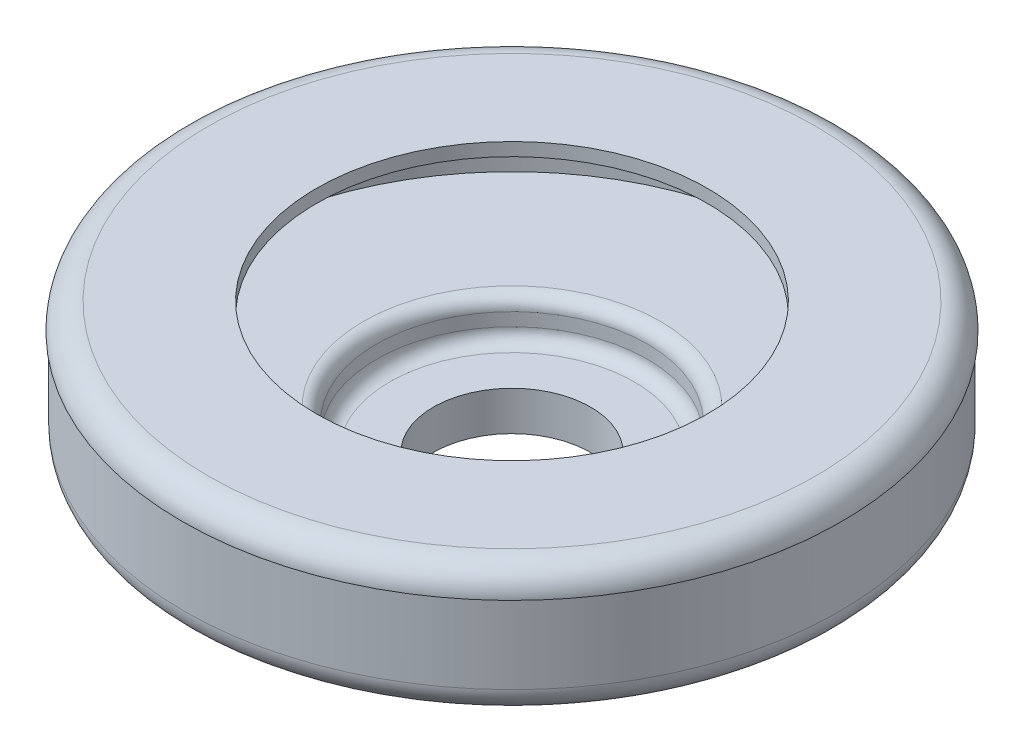
ISO-10303-21;
HEADER;
FILE_DESCRIPTION(('STEP AP214'),'2;1');
FILE_NAME('part.step','',(''),(''),'','','');
FILE_SCHEMA(('AUTOMOTIVE_DESIGN { 1 0 10303 214 1 1 1 1 }'));
ENDSEC;
DATA;
#1=APPLICATION_CONTEXT('core data for automotive mechanical design processes');
#2=APPLICATION_PROTOCOL_DEFINITION('international standard','automotive_design',2000,#1);
#3=PRODUCT_CONTEXT('',#1,'mechanical');
#4=PRODUCT('Part','Part','',(#3));
#5=PRODUCT_RELATED_PRODUCT_CATEGORY('part','',(#4));
#6=PRODUCT_DEFINITION_FORMATION('','',#4);
#7=PRODUCT_DEFINITION_CONTEXT('part definition',#1,'design');
#8=PRODUCT_DEFINITION('design','',#6,#7);
#9=PRODUCT_DEFINITION_SHAPE('','',#8);
#10=(LENGTH_UNIT() NAMED_UNIT(*) SI_UNIT(.MILLI.,.METRE.));
#11=(NAMED_UNIT(*) PLANE_ANGLE_UNIT() SI_UNIT($,.RADIAN.));
#12=(NAMED_UNIT(*) SI_UNIT($,.STERADIAN.) SOLID_ANGLE_UNIT());
#13=UNCERTAINTY_MEASURE_WITH_UNIT(LENGTH_MEASURE(1.E-05),#10,'distance_accuracy_value','');
#14=(GEOMETRIC_REPRESENTATION_CONTEXT(3) GLOBAL_UNCERTAINTY_ASSIGNED_CONTEXT((#13)) GLOBAL_UNIT_ASSIGNED_CONTEXT((#10,
#11,#12)) REPRESENTATION_CONTEXT('',''));
#15=CARTESIAN_POINT('',(0.,0.,0.));
#16=DIRECTION('',(0.,0.,1.));
#17=DIRECTION('',(1.,0.,0.));
#18=AXIS2_PLACEMENT_3D('',#15,#16,#17);
#19=CARTESIAN_POINT('',(0.,-8.,0.));
#20=DIRECTION('',(0.,1.,0.));
#21=DIRECTION('',(0.,0.,1.));
#22=AXIS2_PLACEMENT_3D('',#19,#20,#21);
#23=CYLINDRICAL_SURFACE('',#22,22.);
#24=CARTESIAN_POINT('',(0.,-5.,0.));
#25=DIRECTION('',(0.,1.,0.));
#26=DIRECTION('',(0.,0.,1.));
#27=AXIS2_PLACEMENT_3D('',#24,#25,#26);
#28=CIRCLE('',#27,22.);
#29=CARTESIAN_POINT('',(0.,-5.,22.));
#30=VERTEX_POINT('',#29);
#31=EDGE_CURVE('E89',#30,#30,#28,.T.);
#32=ORIENTED_EDGE('',*,*,#31,.F.);
#33=EDGE_LOOP('',(#32));
#34=FACE_BOUND('',#33,.T.);
#35=CARTESIAN_POINT('',(0.,1.,0.));
#36=DIRECTION('',(0.,1.,0.));
#37=DIRECTION('',(0.,0.,1.));
#38=AXIS2_PLACEMENT_3D('',#35,#36,#37);
#39=CIRCLE('',#38,22.);
#40=CARTESIAN_POINT('',(0.,1.,22.));
#41=VERTEX_POINT('',#40);
#42=EDGE_CURVE('E49',#41,#41,#39,.F.);
#43=ORIENTED_EDGE('',*,*,#42,.F.);
#44=EDGE_LOOP('',(#43));
#45=FACE_BOUND('',#44,.T.);
#46=ADVANCED_FACE('F34',(#34,#45),#23,.F.);
#47=CARTESIAN_POINT('',(0.,2.,0.));
#48=DIRECTION('',(0.,-1.,0.));
#49=DIRECTION('',(0.,0.,-1.));
#50=AXIS2_PLACEMENT_3D('',#47,#48,#49);
#51=PLANE('',#50);
#52=CARTESIAN_POINT('',(0.,2.,0.));
#53=DIRECTION('',(0.,-1.,0.));
#54=DIRECTION('',(0.,0.,-1.));
#55=AXIS2_PLACEMENT_3D('',#52,#53,#54);
#56=CIRCLE('',#55,23.1478558864626);
#57=CARTESIAN_POINT('',(0.,2.,-23.1478558864626));
#58=VERTEX_POINT('',#57);
#59=EDGE_CURVE('E45',#58,#58,#56,.F.);
#60=ORIENTED_EDGE('',*,*,#59,.T.);
#61=EDGE_LOOP('',(#60));
#62=FACE_BOUND('',#61,.T.);
#63=CARTESIAN_POINT('',(0.,2.,0.));
#64=DIRECTION('',(0.,1.,0.));
#65=DIRECTION('',(0.,0.,1.));
#66=AXIS2_PLACEMENT_3D('',#63,#64,#65);
#67=CIRCLE('',#66,14.9171367031987);
#68=CARTESIAN_POINT('',(0.,2.,14.9171367031987));
#69=VERTEX_POINT('',#68);
#70=EDGE_CURVE('E94',#69,#69,#67,.T.);
#71=ORIENTED_EDGE('',*,*,#70,.F.);
#72=EDGE_LOOP('',(#71));
#73=FACE_BOUND('',#72,.T.);
#74=ADVANCED_FACE('F110',(#62,#73),#51,.F.);
#75=CARTESIAN_POINT('',(0.,0.,0.));
#76=DIRECTION('',(0.,-1.,0.));
#77=DIRECTION('',(0.,0.,-1.));
#78=AXIS2_PLACEMENT_3D('',#75,#76,#77);
#79=PLANE('',#78);
#80=CARTESIAN_POINT('',(0.,0.,0.));
#81=DIRECTION('',(0.,-1.,0.));
#82=DIRECTION('',(0.,0.,-1.));
#83=AXIS2_PLACEMENT_3D('',#80,#81,#82);
#84=CIRCLE('',#83,25.);
#85=CARTESIAN_POINT('',(0.,0.,-25.));
#86=VERTEX_POINT('',#85);
#87=EDGE_CURVE('E86',#86,#86,#84,.T.);
#88=ORIENTED_EDGE('',*,*,#87,.F.);
#89=EDGE_LOOP('',(#88));
#90=FACE_BOUND('',#89,.T.);
#91=CARTESIAN_POINT('',(0.,0.,0.));
#92=DIRECTION('',(0.,-1.,0.));
#93=DIRECTION('',(0.,0.,-1.));
#94=AXIS2_PLACEMENT_3D('',#91,#92,#93);
#95=CIRCLE('',#94,25.1478558864626);
#96=CARTESIAN_POINT('',(0.,0.,-25.1478558864626));
#97=VERTEX_POINT('',#96);
#98=EDGE_CURVE('E55',#97,#97,#95,.T.);
#99=ORIENTED_EDGE('',*,*,#98,.T.);
#100=EDGE_LOOP('',(#99));
#101=FACE_BOUND('',#100,.T.);
#102=ADVANCED_FACE('F112',(#90,#101),#79,.T.);
#103=CARTESIAN_POINT('',(0.,-8.,0.));
#104=DIRECTION('',(0.,1.,0.));
#105=DIRECTION('',(0.,0.,1.));
#106=AXIS2_PLACEMENT_3D('',#103,#104,#105);
#107=CYLINDRICAL_SURFACE('',#106,25.);
#108=CARTESIAN_POINT('',(0.,-6.,0.));
#109=DIRECTION('',(0.,1.,0.));
#110=DIRECTION('',(0.,0.,1.));
#111=AXIS2_PLACEMENT_3D('',#108,#109,#110);
#112=CIRCLE('',#111,25.);
#113=CARTESIAN_POINT('',(0.,-6.,25.));
#114=VERTEX_POINT('',#113);
#115=EDGE_CURVE('E41',#114,#114,#112,.T.);
#116=ORIENTED_EDGE('',*,*,#115,.T.);
#117=EDGE_LOOP('',(#116));
#118=FACE_BOUND('',#117,.T.);
#119=ORIENTED_EDGE('',*,*,#87,.T.);
#120=EDGE_LOOP('',(#119));
#121=FACE_BOUND('',#120,.T.);
#122=ADVANCED_FACE('F119',(#118,#121),#107,.T.);
#123=CARTESIAN_POINT('',(0.,-8.,0.));
#124=DIRECTION('',(0.,1.,0.));
#125=DIRECTION('',(0.,0.,1.));
#126=AXIS2_PLACEMENT_3D('',#123,#124,#125);
#127=PLANE('',#126);
#128=CARTESIAN_POINT('',(0.,-8.,0.));
#129=DIRECTION('',(0.,1.,0.));
#130=DIRECTION('',(0.,0.,1.));
#131=AXIS2_PLACEMENT_3D('',#128,#129,#130);
#132=CIRCLE('',#131,23.);
#133=CARTESIAN_POINT('',(0.,-8.,23.));
#134=VERTEX_POINT('',#133);
#135=EDGE_CURVE('E10',#134,#134,#132,.F.);
#136=ORIENTED_EDGE('',*,*,#135,.T.);
#137=EDGE_LOOP('',(#136));
#138=FACE_BOUND('',#137,.T.);
#139=CARTESIAN_POINT('',(0.,-8.,0.));
#140=DIRECTION('',(0.,1.,0.));
#141=DIRECTION('',(0.,0.,1.));
#142=AXIS2_PLACEMENT_3D('',#139,#140,#141);
#143=CIRCLE('',#142,14.3322776099932);
#144=CARTESIAN_POINT('',(0.,-8.,14.3322776099932));
#145=VERTEX_POINT('',#144);
#146=EDGE_CURVE('E74',#145,#145,#143,.T.);
#147=ORIENTED_EDGE('',*,*,#146,.T.);
#148=EDGE_LOOP('',(#147));
#149=FACE_BOUND('',#148,.T.);
#150=ADVANCED_FACE('F167',(#138,#149),#127,.F.);
#151=CARTESIAN_POINT('',(0.,-5.,0.));
#152=DIRECTION('',(0.,1.,0.));
#153=DIRECTION('',(0.,0.,1.));
#154=AXIS2_PLACEMENT_3D('',#151,#152,#153);
#155=PLANE('',#154);
#156=CARTESIAN_POINT('',(0.,-5.,0.));
#157=DIRECTION('',(0.,1.,0.));
#158=DIRECTION('',(0.,0.,1.));
#159=AXIS2_PLACEMENT_3D('',#156,#157,#158);
#160=CIRCLE('',#159,11.3322776099932);
#161=CARTESIAN_POINT('',(0.,-5.,11.3322776099932));
#162=VERTEX_POINT('',#161);
#163=EDGE_CURVE('E54',#162,#162,#160,.F.);
#164=ORIENTED_EDGE('',*,*,#163,.T.);
#165=EDGE_LOOP('',(#164));
#166=FACE_BOUND('',#165,.T.);
#167=ORIENTED_EDGE('',*,*,#31,.T.);
#168=EDGE_LOOP('',(#167));
#169=FACE_BOUND('',#168,.T.);
#170=ADVANCED_FACE('F172',(#166,#169),#155,.T.);
#171=CARTESIAN_POINT('',(0.,-11.,0.));
#172=DIRECTION('',(0.,1.,0.));
#173=DIRECTION('',(0.,0.,1.));
#174=AXIS2_PLACEMENT_3D('',#171,#172,#173);
#175=CYLINDRICAL_SURFACE('',#174,13.3322776099932);
#176=CARTESIAN_POINT('',(0.,-10.,0.));
#177=DIRECTION('',(0.,1.,0.));
#178=DIRECTION('',(0.,0.,1.));
#179=AXIS2_PLACEMENT_3D('',#176,#177,#178);
#180=CIRCLE('',#179,13.3322776099932);
#181=CARTESIAN_POINT('',(0.,-10.,13.3322776099932));
#182=VERTEX_POINT('',#181);
#183=EDGE_CURVE('E80',#182,#182,#180,.T.);
#184=ORIENTED_EDGE('',*,*,#183,.T.);
#185=EDGE_LOOP('',(#184));
#186=FACE_BOUND('',#185,.T.);
#187=CARTESIAN_POINT('',(0.,-9.,0.));
#188=DIRECTION('',(0.,1.,0.));
#189=DIRECTION('',(0.,0.,1.));
#190=AXIS2_PLACEMENT_3D('',#187,#188,#189);
#191=CIRCLE('',#190,13.3322776099932);
#192=CARTESIAN_POINT('',(0.,-9.,13.3322776099932));
#193=VERTEX_POINT('',#192);
#194=EDGE_CURVE('E83',#193,#193,#191,.F.);
#195=ORIENTED_EDGE('',*,*,#194,.T.);
#196=EDGE_LOOP('',(#195));
#197=FACE_BOUND('',#196,.T.);
#198=ADVANCED_FACE('F244',(#186,#197),#175,.T.);
#199=CARTESIAN_POINT('',(0.,-11.,0.));
#200=DIRECTION('',(0.,1.,0.));
#201=DIRECTION('',(0.,0.,1.));
#202=AXIS2_PLACEMENT_3D('',#199,#200,#201);
#203=PLANE('',#202);
#204=CARTESIAN_POINT('',(0.,-11.,0.));
#205=DIRECTION('',(0.,1.,0.));
#206=DIRECTION('',(0.,0.,1.));
#207=AXIS2_PLACEMENT_3D('',#204,#205,#206);
#208=CIRCLE('',#207,6.);
#209=CARTESIAN_POINT('',(0.,-11.,6.));
#210=VERTEX_POINT('',#209);
#211=EDGE_CURVE('E62',#210,#210,#208,.T.);
#212=ORIENTED_EDGE('',*,*,#211,.T.);
#213=EDGE_LOOP('',(#212));
#214=FACE_BOUND('',#213,.T.);
#215=CARTESIAN_POINT('',(0.,-11.,0.));
#216=DIRECTION('',(0.,1.,0.));
#217=DIRECTION('',(0.,0.,1.));
#218=AXIS2_PLACEMENT_3D('',#215,#216,#217);
#219=CIRCLE('',#218,12.3322776099932);
#220=CARTESIAN_POINT('',(0.,-11.,12.3322776099932));
#221=VERTEX_POINT('',#220);
#222=EDGE_CURVE('E77',#221,#221,#219,.F.);
#223=ORIENTED_EDGE('',*,*,#222,.T.);
#224=EDGE_LOOP('',(#223));
#225=FACE_BOUND('',#224,.T.);
#226=ADVANCED_FACE('F239',(#214,#225),#203,.F.);
#227=CARTESIAN_POINT('',(0.,-11.,0.));
#228=DIRECTION('',(0.,1.,0.));
#229=DIRECTION('',(0.,0.,1.));
#230=AXIS2_PLACEMENT_3D('',#227,#228,#229);
#231=CYLINDRICAL_SURFACE('',#230,10.3322776099932);
#232=CARTESIAN_POINT('',(0.,-7.,0.));
#233=DIRECTION('',(0.,1.,0.));
#234=DIRECTION('',(0.,0.,1.));
#235=AXIS2_PLACEMENT_3D('',#232,#233,#234);
#236=CIRCLE('',#235,10.3322776099932);
#237=CARTESIAN_POINT('',(0.,-7.,10.3322776099932));
#238=VERTEX_POINT('',#237);
#239=EDGE_CURVE('E65',#238,#238,#236,.F.);
#240=ORIENTED_EDGE('',*,*,#239,.T.);
#241=EDGE_LOOP('',(#240));
#242=FACE_BOUND('',#241,.T.);
#243=CARTESIAN_POINT('',(0.,-6.,0.));
#244=DIRECTION('',(0.,1.,0.));
#245=DIRECTION('',(0.,0.,1.));
#246=AXIS2_PLACEMENT_3D('',#243,#244,#245);
#247=CIRCLE('',#246,10.3322776099932);
#248=CARTESIAN_POINT('',(0.,-6.,10.3322776099932));
#249=VERTEX_POINT('',#248);
#250=EDGE_CURVE('E68',#249,#249,#247,.T.);
#251=ORIENTED_EDGE('',*,*,#250,.T.);
#252=EDGE_LOOP('',(#251));
#253=FACE_BOUND('',#252,.T.);
#254=ADVANCED_FACE('F230',(#242,#253),#231,.F.);
#255=CARTESIAN_POINT('',(0.,-8.,0.));
#256=DIRECTION('',(0.,1.,0.));
#257=DIRECTION('',(0.,0.,1.));
#258=AXIS2_PLACEMENT_3D('',#255,#256,#257);
#259=PLANE('',#258);
#260=CARTESIAN_POINT('',(0.,-8.,0.));
#261=DIRECTION('',(0.,1.,0.));
#262=DIRECTION('',(0.,0.,1.));
#263=AXIS2_PLACEMENT_3D('',#260,#261,#262);
#264=CIRCLE('',#263,6.);
#265=CARTESIAN_POINT('',(0.,-8.,6.));
#266=VERTEX_POINT('',#265);
#267=EDGE_CURVE('E58',#266,#266,#264,.T.);
#268=ORIENTED_EDGE('',*,*,#267,.F.);
#269=EDGE_LOOP('',(#268));
#270=FACE_BOUND('',#269,.T.);
#271=CARTESIAN_POINT('',(0.,-8.,0.));
#272=DIRECTION('',(0.,1.,0.));
#273=DIRECTION('',(0.,0.,1.));
#274=AXIS2_PLACEMENT_3D('',#271,#272,#273);
#275=CIRCLE('',#274,9.33227760999318);
#276=CARTESIAN_POINT('',(0.,-8.,9.33227760999318));
#277=VERTEX_POINT('',#276);
#278=EDGE_CURVE('E71',#277,#277,#275,.T.);
#279=ORIENTED_EDGE('',*,*,#278,.T.);
#280=EDGE_LOOP('',(#279));
#281=FACE_BOUND('',#280,.T.);
#282=ADVANCED_FACE('F131',(#270,#281),#259,.T.);
#283=CARTESIAN_POINT('',(0.,-10.,0.));
#284=DIRECTION('',(0.,1.,0.));
#285=DIRECTION('',(0.,0.,1.));
#286=AXIS2_PLACEMENT_3D('',#283,#284,#285);
#287=TOROIDAL_SURFACE('',#286,12.3322776099932,1.);
#288=ORIENTED_EDGE('',*,*,#222,.F.);
#289=EDGE_LOOP('',(#288));
#290=FACE_BOUND('',#289,.T.);
#291=ORIENTED_EDGE('',*,*,#183,.F.);
#292=EDGE_LOOP('',(#291));
#293=FACE_BOUND('',#292,.T.);
#294=ADVANCED_FACE('F127',(#290,#293),#287,.T.);
#295=CARTESIAN_POINT('',(0.,-9.,0.));
#296=DIRECTION('',(0.,1.,0.));
#297=DIRECTION('',(0.,0.,1.));
#298=AXIS2_PLACEMENT_3D('',#295,#296,#297);
#299=TOROIDAL_SURFACE('',#298,14.3322776099932,1.);
#300=ORIENTED_EDGE('',*,*,#194,.F.);
#301=EDGE_LOOP('',(#300));
#302=FACE_BOUND('',#301,.T.);
#303=ORIENTED_EDGE('',*,*,#146,.F.);
#304=EDGE_LOOP('',(#303));
#305=FACE_BOUND('',#304,.T.);
#306=ADVANCED_FACE('F130',(#302,#305),#299,.F.);
#307=CARTESIAN_POINT('',(0.,-7.,0.));
#308=DIRECTION('',(0.,1.,0.));
#309=DIRECTION('',(0.,0.,1.));
#310=AXIS2_PLACEMENT_3D('',#307,#308,#309);
#311=TOROIDAL_SURFACE('',#310,9.33227760999318,1.);
#312=ORIENTED_EDGE('',*,*,#239,.F.);
#313=EDGE_LOOP('',(#312));
#314=FACE_BOUND('',#313,.T.);
#315=ORIENTED_EDGE('',*,*,#278,.F.);
#316=EDGE_LOOP('',(#315));
#317=FACE_BOUND('',#316,.T.);
#318=ADVANCED_FACE('F135',(#314,#317),#311,.F.);
#319=CARTESIAN_POINT('',(0.,-6.,0.));
#320=DIRECTION('',(0.,1.,0.));
#321=DIRECTION('',(0.,0.,1.));
#322=AXIS2_PLACEMENT_3D('',#319,#320,#321);
#323=TOROIDAL_SURFACE('',#322,11.3322776099932,1.);
#324=ORIENTED_EDGE('',*,*,#163,.F.);
#325=EDGE_LOOP('',(#324));
#326=FACE_BOUND('',#325,.T.);
#327=ORIENTED_EDGE('',*,*,#250,.F.);
#328=EDGE_LOOP('',(#327));
#329=FACE_BOUND('',#328,.T.);
#330=ADVANCED_FACE('F139',(#326,#329),#323,.T.);
#331=CARTESIAN_POINT('',(0.,-24.9,0.));
#332=DIRECTION('',(0.,1.,0.));
#333=DIRECTION('',(0.,0.,1.));
#334=AXIS2_PLACEMENT_3D('',#331,#332,#333);
#335=CYLINDRICAL_SURFACE('',#334,6.);
#336=ORIENTED_EDGE('',*,*,#267,.T.);
#337=EDGE_LOOP('',(#336));
#338=FACE_BOUND('',#337,.T.);
#339=ORIENTED_EDGE('',*,*,#211,.F.);
#340=EDGE_LOOP('',(#339));
#341=FACE_BOUND('',#340,.T.);
#342=ADVANCED_FACE('F142',(#338,#341),#335,.F.);
#343=CARTESIAN_POINT('',(0.,1.,0.));
#344=DIRECTION('',(0.,1.,0.));
#345=DIRECTION('',(0.,0.,1.));
#346=AXIS2_PLACEMENT_3D('',#343,#344,#345);
#347=PLANE('',#346);
#348=CARTESIAN_POINT('',(0.,1.,0.));
#349=DIRECTION('',(0.,1.,0.));
#350=DIRECTION('',(0.,0.,1.));
#351=AXIS2_PLACEMENT_3D('',#348,#349,#350);
#352=CIRCLE('',#351,14.9171367031987);
#353=CARTESIAN_POINT('',(0.,1.,14.9171367031987));
#354=VERTEX_POINT('',#353);
#355=EDGE_CURVE('E59',#354,#354,#352,.T.);
#356=ORIENTED_EDGE('',*,*,#355,.T.);
#357=EDGE_LOOP('',(#356));
#358=FACE_BOUND('',#357,.T.);
#359=ORIENTED_EDGE('',*,*,#42,.T.);
#360=EDGE_LOOP('',(#359));
#361=FACE_BOUND('',#360,.T.);
#362=ADVANCED_FACE('F100',(#358,#361),#347,.F.);
#363=CARTESIAN_POINT('',(0.,1.,0.));
#364=DIRECTION('',(0.,1.,0.));
#365=DIRECTION('',(0.,0.,1.));
#366=AXIS2_PLACEMENT_3D('',#363,#364,#365);
#367=CYLINDRICAL_SURFACE('',#366,14.9171367031987);
#368=ORIENTED_EDGE('',*,*,#355,.F.);
#369=EDGE_LOOP('',(#368));
#370=FACE_BOUND('',#369,.T.);
#371=ORIENTED_EDGE('',*,*,#70,.T.);
#372=EDGE_LOOP('',(#371));
#373=FACE_BOUND('',#372,.T.);
#374=ADVANCED_FACE('F103',(#370,#373),#367,.F.);
#375=CARTESIAN_POINT('',(0.,0.,0.));
#376=DIRECTION('',(0.,-1.,0.));
#377=DIRECTION('',(0.,0.,-1.));
#378=AXIS2_PLACEMENT_3D('',#375,#376,#377);
#379=TOROIDAL_SURFACE('',#378,23.1478558864626,2.);
#380=ORIENTED_EDGE('',*,*,#98,.F.);
#381=EDGE_LOOP('',(#380));
#382=FACE_BOUND('',#381,.T.);
#383=ORIENTED_EDGE('',*,*,#59,.F.);
#384=EDGE_LOOP('',(#383));
#385=FACE_BOUND('',#384,.T.);
#386=ADVANCED_FACE('F106',(#382,#385),#379,.T.);
#387=CARTESIAN_POINT('',(0.,-6.,0.));
#388=DIRECTION('',(0.,1.,0.));
#389=DIRECTION('',(0.,0.,1.));
#390=AXIS2_PLACEMENT_3D('',#387,#388,#389);
#391=TOROIDAL_SURFACE('',#390,23.,2.);
#392=ORIENTED_EDGE('',*,*,#135,.F.);
#393=EDGE_LOOP('',(#392));
#394=FACE_BOUND('',#393,.T.);
#395=ORIENTED_EDGE('',*,*,#115,.F.);
#396=EDGE_LOOP('',(#395));
#397=FACE_BOUND('',#396,.T.);
#398=ADVANCED_FACE('F36',(#394,#397),#391,.T.);
#399=CLOSED_SHELL('',(#46,#74,#102,#122,#150,#170,#198,#226,#254,#282,#294,#306,#318,#330,#342,
#362,#374,#386,#398));
#400=MANIFOLD_SOLID_BREP('B2',#399);
#401=ADVANCED_BREP_SHAPE_REPRESENTATION('',(#18,#400),#14);
#402=SHAPE_DEFINITION_REPRESENTATION(#9,#401);
ENDSEC;
END-ISO-10303-21;
